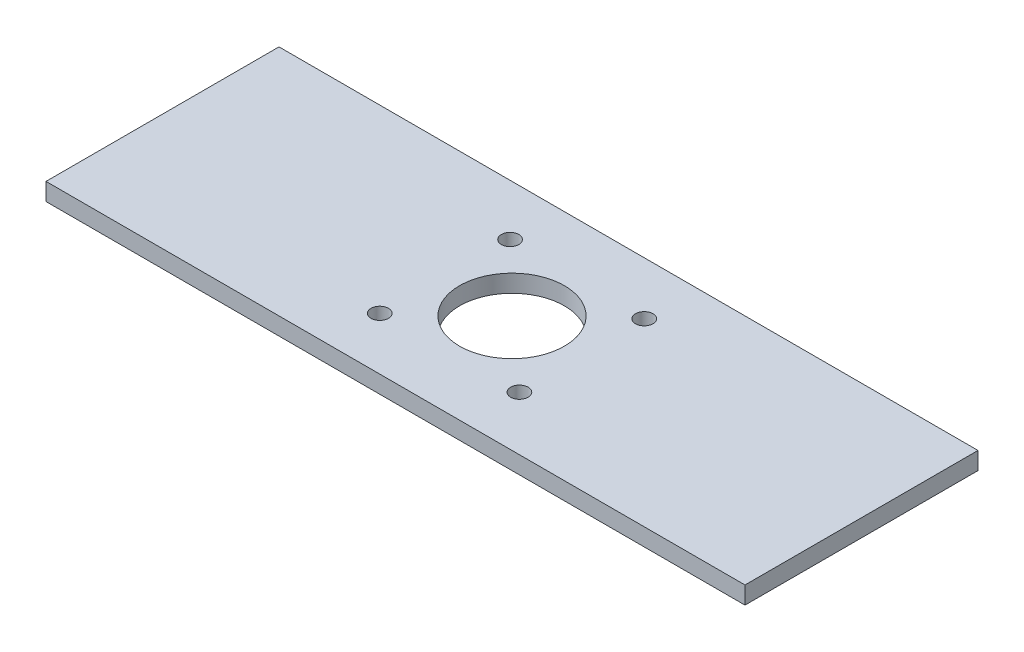
ISO-10303-21;
HEADER;
FILE_DESCRIPTION(('STEP AP214'),'2;1');
FILE_NAME('part.step','',(''),(''),'','','');
FILE_SCHEMA(('AUTOMOTIVE_DESIGN { 1 0 10303 214 1 1 1 1 }'));
ENDSEC;
DATA;
#1=APPLICATION_CONTEXT('core data for automotive mechanical design processes');
#2=APPLICATION_PROTOCOL_DEFINITION('international standard','automotive_design',2000,#1);
#3=PRODUCT_CONTEXT('',#1,'mechanical');
#4=PRODUCT('Part','Part','',(#3));
#5=PRODUCT_RELATED_PRODUCT_CATEGORY('part','',(#4));
#6=PRODUCT_DEFINITION_FORMATION('','',#4);
#7=PRODUCT_DEFINITION_CONTEXT('part definition',#1,'design');
#8=PRODUCT_DEFINITION('design','',#6,#7);
#9=PRODUCT_DEFINITION_SHAPE('','',#8);
#10=(LENGTH_UNIT() NAMED_UNIT(*) SI_UNIT(.MILLI.,.METRE.));
#11=(NAMED_UNIT(*) PLANE_ANGLE_UNIT() SI_UNIT($,.RADIAN.));
#12=(NAMED_UNIT(*) SI_UNIT($,.STERADIAN.) SOLID_ANGLE_UNIT());
#13=UNCERTAINTY_MEASURE_WITH_UNIT(LENGTH_MEASURE(1.E-05),#10,'distance_accuracy_value','');
#14=(GEOMETRIC_REPRESENTATION_CONTEXT(3) GLOBAL_UNCERTAINTY_ASSIGNED_CONTEXT((#13)) GLOBAL_UNIT_ASSIGNED_CONTEXT((#10,
#11,#12)) REPRESENTATION_CONTEXT('',''));
#15=CARTESIAN_POINT('',(0.,0.,0.));
#16=DIRECTION('',(0.,0.,1.));
#17=DIRECTION('',(1.,0.,0.));
#18=AXIS2_PLACEMENT_3D('',#15,#16,#17);
#19=CARTESIAN_POINT('',(0.,4.7625,0.));
#20=DIRECTION('',(0.,-1.,0.));
#21=DIRECTION('',(0.,0.,-1.));
#22=AXIS2_PLACEMENT_3D('',#19,#20,#21);
#23=PLANE('',#22);
#24=CARTESIAN_POINT('',(-18.6292634417096,4.7625,17.4149977369905));
#25=DIRECTION('',(0.,1.,0.));
#26=DIRECTION('',(0.,0.,1.));
#27=AXIS2_PLACEMENT_3D('',#24,#25,#26);
#28=CIRCLE('',#27,2.38124999999999);
#29=CARTESIAN_POINT('',(-18.6292634417096,4.7625,19.7962477369905));
#30=VERTEX_POINT('',#29);
#31=EDGE_CURVE('E132',#30,#30,#28,.T.);
#32=ORIENTED_EDGE('',*,*,#31,.F.);
#33=EDGE_LOOP('',(#32));
#34=FACE_BOUND('',#33,.T.);
#35=CARTESIAN_POINT('',(18.6853335499434,4.7625,-17.3548239025165));
#36=DIRECTION('',(0.,1.,0.));
#37=DIRECTION('',(0.,0.,1.));
#38=AXIS2_PLACEMENT_3D('',#35,#36,#37);
#39=CIRCLE('',#38,2.38124999999999);
#40=CARTESIAN_POINT('',(18.6853335499434,4.7625,-14.9735739025166));
#41=VERTEX_POINT('',#40);
#42=EDGE_CURVE('E126',#41,#41,#39,.T.);
#43=ORIENTED_EDGE('',*,*,#42,.F.);
#44=EDGE_LOOP('',(#43));
#45=FACE_BOUND('',#44,.T.);
#46=CARTESIAN_POINT('',(19.0134317555712,4.7625,16.9947349328031));
#47=DIRECTION('',(0.,1.,0.));
#48=DIRECTION('',(0.,0.,1.));
#49=AXIS2_PLACEMENT_3D('',#46,#47,#48);
#50=CIRCLE('',#49,2.38124999999999);
#51=CARTESIAN_POINT('',(19.0134317555712,4.7625,19.3759849328031));
#52=VERTEX_POINT('',#51);
#53=EDGE_CURVE('E120',#52,#52,#50,.T.);
#54=ORIENTED_EDGE('',*,*,#53,.F.);
#55=EDGE_LOOP('',(#54));
#56=FACE_BOUND('',#55,.T.);
#57=CARTESIAN_POINT('',(0.,4.7625,0.));
#58=DIRECTION('',(0.,1.,0.));
#59=DIRECTION('',(0.,0.,1.));
#60=AXIS2_PLACEMENT_3D('',#57,#58,#59);
#61=CIRCLE('',#60,14.2875);
#62=CARTESIAN_POINT('',(0.,4.7625,14.2875));
#63=VERTEX_POINT('',#62);
#64=EDGE_CURVE('E112',#63,#63,#61,.T.);
#65=ORIENTED_EDGE('',*,*,#64,.F.);
#66=EDGE_LOOP('',(#65));
#67=FACE_BOUND('',#66,.T.);
#68=DIRECTION('',(0.,0.,-1.));
#69=VECTOR('',#68,1.);
#70=CARTESIAN_POINT('',(95.25,4.7625,31.75));
#71=LINE('',#70,#69);
#72=CARTESIAN_POINT('',(95.25,4.7625,31.75));
#73=VERTEX_POINT('',#72);
#74=CARTESIAN_POINT('',(95.25,4.7625,-31.75));
#75=VERTEX_POINT('',#74);
#76=EDGE_CURVE('E85',#73,#75,#71,.T.);
#77=ORIENTED_EDGE('',*,*,#76,.T.);
#78=DIRECTION('',(-1.,0.,0.));
#79=VECTOR('',#78,1.);
#80=CARTESIAN_POINT('',(-95.25,4.7625,-31.75));
#81=LINE('',#80,#79);
#82=CARTESIAN_POINT('',(-95.25,4.7625,-31.75));
#83=VERTEX_POINT('',#82);
#84=EDGE_CURVE('E80',#75,#83,#81,.T.);
#85=ORIENTED_EDGE('',*,*,#84,.T.);
#86=DIRECTION('',(0.,0.,1.));
#87=VECTOR('',#86,1.);
#88=CARTESIAN_POINT('',(-95.25,4.7625,31.75));
#89=LINE('',#88,#87);
#90=CARTESIAN_POINT('',(-95.25,4.7625,31.75));
#91=VERTEX_POINT('',#90);
#92=EDGE_CURVE('E83',#83,#91,#89,.T.);
#93=ORIENTED_EDGE('',*,*,#92,.T.);
#94=DIRECTION('',(1.,0.,0.));
#95=VECTOR('',#94,1.);
#96=CARTESIAN_POINT('',(-95.25,4.7625,31.75));
#97=LINE('',#96,#95);
#98=EDGE_CURVE('E50',#91,#73,#97,.T.);
#99=ORIENTED_EDGE('',*,*,#98,.T.);
#100=EDGE_LOOP('',(#77,#85,#93,#99));
#101=FACE_BOUND('',#100,.T.);
#102=CARTESIAN_POINT('',(-18.292133045981,4.7625,-17.7687779880364));
#103=DIRECTION('',(0.,1.,0.));
#104=DIRECTION('',(0.,0.,1.));
#105=AXIS2_PLACEMENT_3D('',#102,#103,#104);
#106=CIRCLE('',#105,2.38124999999999);
#107=CARTESIAN_POINT('',(-18.292133045981,4.7625,-15.3875279880365));
#108=VERTEX_POINT('',#107);
#109=EDGE_CURVE('E138',#108,#108,#106,.T.);
#110=ORIENTED_EDGE('',*,*,#109,.F.);
#111=EDGE_LOOP('',(#110));
#112=FACE_BOUND('',#111,.T.);
#113=ADVANCED_FACE('F33',(#34,#45,#56,#67,#101,#112),#23,.F.);
#114=CARTESIAN_POINT('',(0.,0.,0.));
#115=DIRECTION('',(0.,-1.,0.));
#116=DIRECTION('',(0.,0.,-1.));
#117=AXIS2_PLACEMENT_3D('',#114,#115,#116);
#118=PLANE('',#117);
#119=CARTESIAN_POINT('',(-18.292133045981,0.,-17.7687779880364));
#120=DIRECTION('',(0.,1.,0.));
#121=DIRECTION('',(0.,0.,1.));
#122=AXIS2_PLACEMENT_3D('',#119,#120,#121);
#123=CIRCLE('',#122,2.38125);
#124=CARTESIAN_POINT('',(-18.292133045981,0.,-15.3875279880364));
#125=VERTEX_POINT('',#124);
#126=EDGE_CURVE('E135',#125,#125,#123,.T.);
#127=ORIENTED_EDGE('',*,*,#126,.T.);
#128=EDGE_LOOP('',(#127));
#129=FACE_BOUND('',#128,.T.);
#130=DIRECTION('',(0.,0.,-1.));
#131=VECTOR('',#130,1.);
#132=CARTESIAN_POINT('',(95.25,0.,31.75));
#133=LINE('',#132,#131);
#134=CARTESIAN_POINT('',(95.25,0.,31.75));
#135=VERTEX_POINT('',#134);
#136=CARTESIAN_POINT('',(95.25,0.,-31.75));
#137=VERTEX_POINT('',#136);
#138=EDGE_CURVE('E97',#135,#137,#133,.T.);
#139=ORIENTED_EDGE('',*,*,#138,.F.);
#140=DIRECTION('',(1.,0.,0.));
#141=VECTOR('',#140,1.);
#142=CARTESIAN_POINT('',(-95.25,0.,31.75));
#143=LINE('',#142,#141);
#144=CARTESIAN_POINT('',(-95.25,0.,31.75));
#145=VERTEX_POINT('',#144);
#146=EDGE_CURVE('E73',#145,#135,#143,.T.);
#147=ORIENTED_EDGE('',*,*,#146,.F.);
#148=DIRECTION('',(0.,0.,1.));
#149=VECTOR('',#148,1.);
#150=CARTESIAN_POINT('',(-95.25,0.,31.75));
#151=LINE('',#150,#149);
#152=CARTESIAN_POINT('',(-95.25,0.,-31.75));
#153=VERTEX_POINT('',#152);
#154=EDGE_CURVE('E67',#153,#145,#151,.T.);
#155=ORIENTED_EDGE('',*,*,#154,.F.);
#156=DIRECTION('',(-1.,0.,0.));
#157=VECTOR('',#156,1.);
#158=CARTESIAN_POINT('',(-95.25,0.,-31.75));
#159=LINE('',#158,#157);
#160=EDGE_CURVE('E89',#137,#153,#159,.T.);
#161=ORIENTED_EDGE('',*,*,#160,.F.);
#162=EDGE_LOOP('',(#139,#147,#155,#161));
#163=FACE_BOUND('',#162,.T.);
#164=CARTESIAN_POINT('',(0.,0.,0.));
#165=DIRECTION('',(0.,1.,0.));
#166=DIRECTION('',(0.,0.,1.));
#167=AXIS2_PLACEMENT_3D('',#164,#165,#166);
#168=CIRCLE('',#167,14.2875);
#169=CARTESIAN_POINT('',(0.,0.,14.2875));
#170=VERTEX_POINT('',#169);
#171=EDGE_CURVE('E100',#170,#170,#168,.T.);
#172=ORIENTED_EDGE('',*,*,#171,.T.);
#173=EDGE_LOOP('',(#172));
#174=FACE_BOUND('',#173,.T.);
#175=CARTESIAN_POINT('',(19.0134317555712,0.,16.9947349328031));
#176=DIRECTION('',(0.,1.,0.));
#177=DIRECTION('',(0.,0.,1.));
#178=AXIS2_PLACEMENT_3D('',#175,#176,#177);
#179=CIRCLE('',#178,2.38125);
#180=CARTESIAN_POINT('',(19.0134317555712,0.,19.3759849328031));
#181=VERTEX_POINT('',#180);
#182=EDGE_CURVE('E115',#181,#181,#179,.T.);
#183=ORIENTED_EDGE('',*,*,#182,.T.);
#184=EDGE_LOOP('',(#183));
#185=FACE_BOUND('',#184,.T.);
#186=CARTESIAN_POINT('',(18.6853335499434,0.,-17.3548239025165));
#187=DIRECTION('',(0.,1.,0.));
#188=DIRECTION('',(0.,0.,1.));
#189=AXIS2_PLACEMENT_3D('',#186,#187,#188);
#190=CIRCLE('',#189,2.38125);
#191=CARTESIAN_POINT('',(18.6853335499434,0.,-14.9735739025165));
#192=VERTEX_POINT('',#191);
#193=EDGE_CURVE('E123',#192,#192,#190,.T.);
#194=ORIENTED_EDGE('',*,*,#193,.T.);
#195=EDGE_LOOP('',(#194));
#196=FACE_BOUND('',#195,.T.);
#197=CARTESIAN_POINT('',(-18.6292634417096,0.,17.4149977369905));
#198=DIRECTION('',(0.,1.,0.));
#199=DIRECTION('',(0.,0.,1.));
#200=AXIS2_PLACEMENT_3D('',#197,#198,#199);
#201=CIRCLE('',#200,2.38125);
#202=CARTESIAN_POINT('',(-18.6292634417096,0.,19.7962477369905));
#203=VERTEX_POINT('',#202);
#204=EDGE_CURVE('E129',#203,#203,#201,.T.);
#205=ORIENTED_EDGE('',*,*,#204,.T.);
#206=EDGE_LOOP('',(#205));
#207=FACE_BOUND('',#206,.T.);
#208=ADVANCED_FACE('F108',(#129,#163,#174,#185,#196,#207),#118,.T.);
#209=CARTESIAN_POINT('',(95.25,4.7625,31.75));
#210=DIRECTION('',(-1.,0.,0.));
#211=DIRECTION('',(0.,0.,1.));
#212=AXIS2_PLACEMENT_3D('',#209,#210,#211);
#213=PLANE('',#212);
#214=ORIENTED_EDGE('',*,*,#138,.T.);
#215=DIRECTION('',(0.,-1.,0.));
#216=VECTOR('',#215,1.);
#217=CARTESIAN_POINT('',(95.25,4.7625,-31.75));
#218=LINE('',#217,#216);
#219=EDGE_CURVE('E11',#75,#137,#218,.T.);
#220=ORIENTED_EDGE('',*,*,#219,.F.);
#221=ORIENTED_EDGE('',*,*,#76,.F.);
#222=DIRECTION('',(0.,-1.,0.));
#223=VECTOR('',#222,1.);
#224=CARTESIAN_POINT('',(95.25,4.7625,31.75));
#225=LINE('',#224,#223);
#226=EDGE_CURVE('E93',#73,#135,#225,.T.);
#227=ORIENTED_EDGE('',*,*,#226,.T.);
#228=EDGE_LOOP('',(#214,#220,#221,#227));
#229=FACE_BOUND('',#228,.T.);
#230=ADVANCED_FACE('F35',(#229),#213,.F.);
#231=CARTESIAN_POINT('',(-95.25,4.7625,-31.75));
#232=DIRECTION('',(0.,0.,1.));
#233=DIRECTION('',(1.,0.,0.));
#234=AXIS2_PLACEMENT_3D('',#231,#232,#233);
#235=PLANE('',#234);
#236=ORIENTED_EDGE('',*,*,#160,.T.);
#237=DIRECTION('',(0.,-1.,0.));
#238=VECTOR('',#237,1.);
#239=CARTESIAN_POINT('',(-95.25,4.7625,-31.75));
#240=LINE('',#239,#238);
#241=EDGE_CURVE('E42',#83,#153,#240,.T.);
#242=ORIENTED_EDGE('',*,*,#241,.F.);
#243=ORIENTED_EDGE('',*,*,#84,.F.);
#244=ORIENTED_EDGE('',*,*,#219,.T.);
#245=EDGE_LOOP('',(#236,#242,#243,#244));
#246=FACE_BOUND('',#245,.T.);
#247=ADVANCED_FACE('F88',(#246),#235,.F.);
#248=CARTESIAN_POINT('',(-95.25,4.7625,31.75));
#249=DIRECTION('',(1.,0.,0.));
#250=DIRECTION('',(0.,0.,-1.));
#251=AXIS2_PLACEMENT_3D('',#248,#249,#250);
#252=PLANE('',#251);
#253=ORIENTED_EDGE('',*,*,#154,.T.);
#254=DIRECTION('',(0.,-1.,0.));
#255=VECTOR('',#254,1.);
#256=CARTESIAN_POINT('',(-95.25,4.7625,31.75));
#257=LINE('',#256,#255);
#258=EDGE_CURVE('E90',#91,#145,#257,.T.);
#259=ORIENTED_EDGE('',*,*,#258,.F.);
#260=ORIENTED_EDGE('',*,*,#92,.F.);
#261=ORIENTED_EDGE('',*,*,#241,.T.);
#262=EDGE_LOOP('',(#253,#259,#260,#261));
#263=FACE_BOUND('',#262,.T.);
#264=ADVANCED_FACE('F91',(#263),#252,.F.);
#265=CARTESIAN_POINT('',(-95.25,4.7625,31.75));
#266=DIRECTION('',(0.,0.,-1.));
#267=DIRECTION('',(-1.,0.,0.));
#268=AXIS2_PLACEMENT_3D('',#265,#266,#267);
#269=PLANE('',#268);
#270=ORIENTED_EDGE('',*,*,#146,.T.);
#271=ORIENTED_EDGE('',*,*,#226,.F.);
#272=ORIENTED_EDGE('',*,*,#98,.F.);
#273=ORIENTED_EDGE('',*,*,#258,.T.);
#274=EDGE_LOOP('',(#270,#271,#272,#273));
#275=FACE_BOUND('',#274,.T.);
#276=ADVANCED_FACE('F105',(#275),#269,.F.);
#277=CARTESIAN_POINT('',(0.,0.,0.));
#278=DIRECTION('',(0.,1.,0.));
#279=DIRECTION('',(0.,0.,1.));
#280=AXIS2_PLACEMENT_3D('',#277,#278,#279);
#281=CYLINDRICAL_SURFACE('',#280,14.2875);
#282=CARTESIAN_POINT('',(0.,0.,14.2875));
#283=CARTESIAN_POINT('',(0.,0.049609375,14.2875));
#284=CARTESIAN_POINT('',(0.,0.09921875,14.2875));
#285=CARTESIAN_POINT('',(0.,0.1984375,14.2875));
#286=CARTESIAN_POINT('',(0.,0.248046875,14.2875));
#287=CARTESIAN_POINT('',(0.,0.347265625,14.2875));
#288=CARTESIAN_POINT('',(0.,0.396875,14.2875));
#289=CARTESIAN_POINT('',(0.,0.49609375,14.2875));
#290=CARTESIAN_POINT('',(0.,0.545703125,14.2875));
#291=CARTESIAN_POINT('',(0.,0.644921875,14.2875));
#292=CARTESIAN_POINT('',(0.,0.69453125,14.2875));
#293=CARTESIAN_POINT('',(0.,0.79375,14.2875));
#294=CARTESIAN_POINT('',(0.,0.843359375,14.2875));
#295=CARTESIAN_POINT('',(0.,0.942578125,14.2875));
#296=CARTESIAN_POINT('',(0.,0.9921875,14.2875));
#297=CARTESIAN_POINT('',(0.,1.09140625,14.2875));
#298=CARTESIAN_POINT('',(0.,1.141015625,14.2875));
#299=CARTESIAN_POINT('',(0.,1.240234375,14.2875));
#300=CARTESIAN_POINT('',(0.,1.28984375,14.2875));
#301=CARTESIAN_POINT('',(0.,1.3890625,14.2875));
#302=CARTESIAN_POINT('',(0.,1.438671875,14.2875));
#303=CARTESIAN_POINT('',(0.,1.537890625,14.2875));
#304=CARTESIAN_POINT('',(0.,1.5875,14.2875));
#305=CARTESIAN_POINT('',(0.,1.68671875,14.2875));
#306=CARTESIAN_POINT('',(0.,1.736328125,14.2875));
#307=CARTESIAN_POINT('',(0.,1.835546875,14.2875));
#308=CARTESIAN_POINT('',(0.,1.88515625,14.2875));
#309=CARTESIAN_POINT('',(0.,1.984375,14.2875));
#310=CARTESIAN_POINT('',(0.,2.033984375,14.2875));
#311=CARTESIAN_POINT('',(0.,2.133203125,14.2875));
#312=CARTESIAN_POINT('',(0.,2.1828125,14.2875));
#313=CARTESIAN_POINT('',(0.,2.28203125,14.2875));
#314=CARTESIAN_POINT('',(0.,2.331640625,14.2875));
#315=CARTESIAN_POINT('',(0.,2.430859375,14.2875));
#316=CARTESIAN_POINT('',(0.,2.48046875,14.2875));
#317=CARTESIAN_POINT('',(0.,2.5796875,14.2875));
#318=CARTESIAN_POINT('',(0.,2.629296875,14.2875));
#319=CARTESIAN_POINT('',(0.,2.728515625,14.2875));
#320=CARTESIAN_POINT('',(0.,2.778125,14.2875));
#321=CARTESIAN_POINT('',(0.,2.87734375,14.2875));
#322=CARTESIAN_POINT('',(0.,2.926953125,14.2875));
#323=CARTESIAN_POINT('',(0.,3.026171875,14.2875));
#324=CARTESIAN_POINT('',(0.,3.07578125,14.2875));
#325=CARTESIAN_POINT('',(0.,3.175,14.2875));
#326=CARTESIAN_POINT('',(0.,3.224609375,14.2875));
#327=CARTESIAN_POINT('',(0.,3.323828125,14.2875));
#328=CARTESIAN_POINT('',(0.,3.3734375,14.2875));
#329=CARTESIAN_POINT('',(0.,3.47265625,14.2875));
#330=CARTESIAN_POINT('',(0.,3.522265625,14.2875));
#331=CARTESIAN_POINT('',(0.,3.621484375,14.2875));
#332=CARTESIAN_POINT('',(0.,3.67109375,14.2875));
#333=CARTESIAN_POINT('',(0.,3.7703125,14.2875));
#334=CARTESIAN_POINT('',(0.,3.819921875,14.2875));
#335=CARTESIAN_POINT('',(0.,3.919140625,14.2875));
#336=CARTESIAN_POINT('',(0.,3.96875,14.2875));
#337=CARTESIAN_POINT('',(0.,4.06796875,14.2875));
#338=CARTESIAN_POINT('',(0.,4.117578125,14.2875));
#339=CARTESIAN_POINT('',(0.,4.216796875,14.2875));
#340=CARTESIAN_POINT('',(0.,4.26640625,14.2875));
#341=CARTESIAN_POINT('',(0.,4.365625,14.2875));
#342=CARTESIAN_POINT('',(0.,4.415234375,14.2875));
#343=CARTESIAN_POINT('',(0.,4.514453125,14.2875));
#344=CARTESIAN_POINT('',(0.,4.5640625,14.2875));
#345=CARTESIAN_POINT('',(0.,4.66328125,14.2875));
#346=CARTESIAN_POINT('',(0.,4.712890625,14.2875));
#347=CARTESIAN_POINT('',(0.,4.7625,14.2875));
#348=B_SPLINE_CURVE_WITH_KNOTS('',3,(#282,#283,#284,#285,#286,#287,#288,#289,#290,#291,#292,
#293,#294,#295,#296,#297,#298,#299,#300,#301,#302,#303,#304,#305,#306,#307,#308,#309,#310,#311,
#312,#313,#314,#315,#316,#317,#318,#319,#320,#321,#322,#323,#324,#325,#326,#327,#328,#329,#330,
#331,#332,#333,#334,#335,#336,#337,#338,#339,#340,#341,#342,#343,#344,#345,#346,#347),
.UNSPECIFIED.,.F.,.F.,(4,2,2,2,2,2,2,2,2,2,2,2,2,2,2,2,2,2,2,2,2,2,2,2,2,2,2,2,2,2,2,2,4),(0.,
0.148828125,0.29765625,0.446484375,0.5953125,0.744140625,0.89296875,1.041796875,1.190625,
1.339453125,1.48828125,1.637109375,1.7859375,1.934765625,2.08359375,2.232421875,2.38125,
2.530078125,2.67890625,2.827734375,2.9765625,3.125390625,3.27421875,3.423046875,3.571875,
3.720703125,3.86953125,4.018359375,4.1671875,4.316015625,4.46484375,4.613671875,4.7625),.UNSPECIFIED.);
#349=EDGE_CURVE('BSEAM155',#170,#63,#348,.T.);
#350=ORIENTED_EDGE('',*,*,#171,.F.);
#351=ORIENTED_EDGE('',*,*,#64,.T.);
#352=ORIENTED_EDGE('',*,*,#349,.T.);
#353=ORIENTED_EDGE('',*,*,#349,.F.);
#354=EDGE_LOOP('',(#350,#352,#351,#353));
#355=FACE_BOUND('',#354,.T.);
#356=ADVANCED_FACE('F155',(#355),#281,.F.);
#357=CARTESIAN_POINT('',(19.0134317555712,4.7625,16.9947349328031));
#358=DIRECTION('',(0.,1.,0.));
#359=DIRECTION('',(0.,0.,1.));
#360=AXIS2_PLACEMENT_3D('',#357,#358,#359);
#361=CYLINDRICAL_SURFACE('',#360,2.38124999999999);
#362=ORIENTED_EDGE('',*,*,#182,.F.);
#363=EDGE_LOOP('',(#362));
#364=FACE_BOUND('',#363,.T.);
#365=ORIENTED_EDGE('',*,*,#53,.T.);
#366=EDGE_LOOP('',(#365));
#367=FACE_BOUND('',#366,.T.);
#368=ADVANCED_FACE('F190',(#364,#367),#361,.F.);
#369=CARTESIAN_POINT('',(18.6853335499434,4.7625,-17.3548239025165));
#370=DIRECTION('',(0.,1.,0.));
#371=DIRECTION('',(0.,0.,1.));
#372=AXIS2_PLACEMENT_3D('',#369,#370,#371);
#373=CYLINDRICAL_SURFACE('',#372,2.38124999999999);
#374=ORIENTED_EDGE('',*,*,#193,.F.);
#375=EDGE_LOOP('',(#374));
#376=FACE_BOUND('',#375,.T.);
#377=ORIENTED_EDGE('',*,*,#42,.T.);
#378=EDGE_LOOP('',(#377));
#379=FACE_BOUND('',#378,.T.);
#380=ADVANCED_FACE('F209',(#376,#379),#373,.F.);
#381=CARTESIAN_POINT('',(-18.6292634417096,4.7625,17.4149977369905));
#382=DIRECTION('',(0.,1.,0.));
#383=DIRECTION('',(0.,0.,1.));
#384=AXIS2_PLACEMENT_3D('',#381,#382,#383);
#385=CYLINDRICAL_SURFACE('',#384,2.38124999999999);
#386=ORIENTED_EDGE('',*,*,#204,.F.);
#387=EDGE_LOOP('',(#386));
#388=FACE_BOUND('',#387,.T.);
#389=ORIENTED_EDGE('',*,*,#31,.T.);
#390=EDGE_LOOP('',(#389));
#391=FACE_BOUND('',#390,.T.);
#392=ADVANCED_FACE('F215',(#388,#391),#385,.F.);
#393=CARTESIAN_POINT('',(-18.292133045981,4.7625,-17.7687779880364));
#394=DIRECTION('',(0.,1.,0.));
#395=DIRECTION('',(0.,0.,1.));
#396=AXIS2_PLACEMENT_3D('',#393,#394,#395);
#397=CYLINDRICAL_SURFACE('',#396,2.38124999999999);
#398=ORIENTED_EDGE('',*,*,#126,.F.);
#399=EDGE_LOOP('',(#398));
#400=FACE_BOUND('',#399,.T.);
#401=ORIENTED_EDGE('',*,*,#109,.T.);
#402=EDGE_LOOP('',(#401));
#403=FACE_BOUND('',#402,.T.);
#404=ADVANCED_FACE('F142',(#400,#403),#397,.F.);
#405=CLOSED_SHELL('',(#113,#208,#230,#247,#264,#276,#356,#368,#380,#392,#404));
#406=MANIFOLD_SOLID_BREP('B2',#405);
#407=ADVANCED_BREP_SHAPE_REPRESENTATION('',(#18,#406),#14);
#408=SHAPE_DEFINITION_REPRESENTATION(#9,#407);
ENDSEC;
END-ISO-10303-21;
